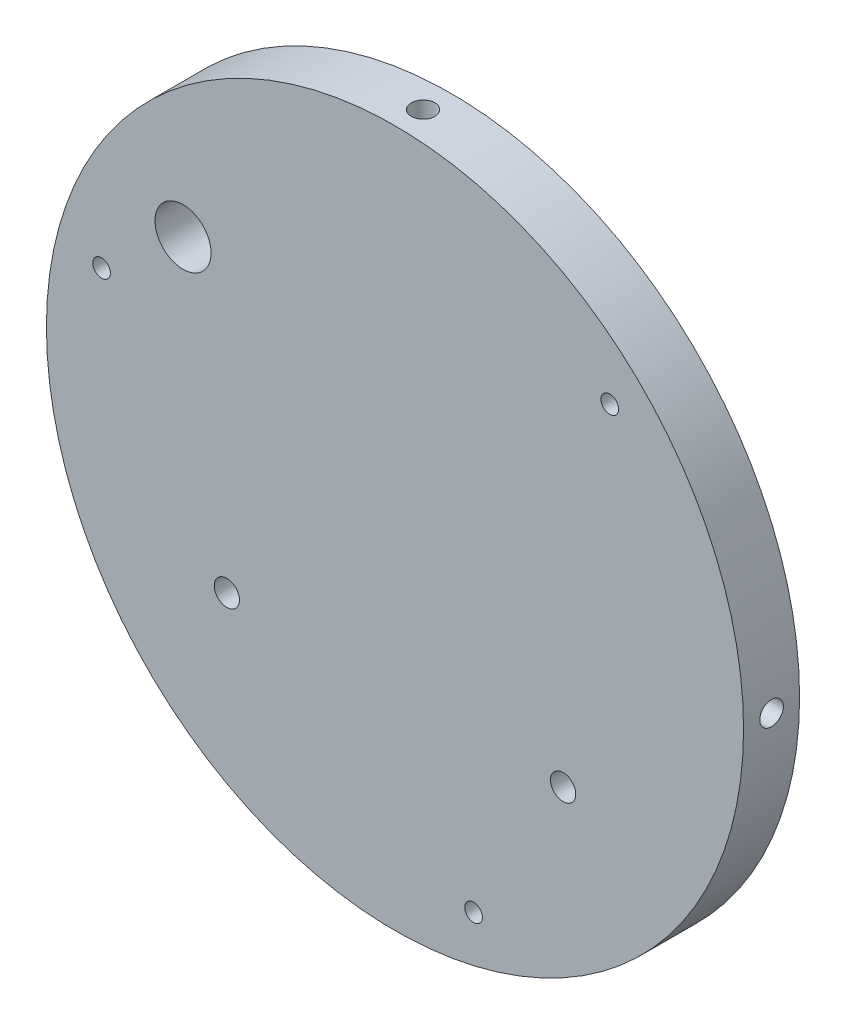
ISO-10303-21;
HEADER;
FILE_DESCRIPTION(('STEP AP214'),'2;1');
FILE_NAME('part.step','',(''),(''),'','','');
FILE_SCHEMA(('AUTOMOTIVE_DESIGN { 1 0 10303 214 1 1 1 1 }'));
ENDSEC;
DATA;
#1=APPLICATION_CONTEXT('core data for automotive mechanical design processes');
#2=APPLICATION_PROTOCOL_DEFINITION('international standard','automotive_design',2000,#1);
#3=PRODUCT_CONTEXT('',#1,'mechanical');
#4=PRODUCT('Part','Part','',(#3));
#5=PRODUCT_RELATED_PRODUCT_CATEGORY('part','',(#4));
#6=PRODUCT_DEFINITION_FORMATION('','',#4);
#7=PRODUCT_DEFINITION_CONTEXT('part definition',#1,'design');
#8=PRODUCT_DEFINITION('design','',#6,#7);
#9=PRODUCT_DEFINITION_SHAPE('','',#8);
#10=(LENGTH_UNIT() NAMED_UNIT(*) SI_UNIT(.MILLI.,.METRE.));
#11=(NAMED_UNIT(*) PLANE_ANGLE_UNIT() SI_UNIT($,.RADIAN.));
#12=(NAMED_UNIT(*) SI_UNIT($,.STERADIAN.) SOLID_ANGLE_UNIT());
#13=UNCERTAINTY_MEASURE_WITH_UNIT(LENGTH_MEASURE(1.E-05),#10,'distance_accuracy_value','');
#14=(GEOMETRIC_REPRESENTATION_CONTEXT(3) GLOBAL_UNCERTAINTY_ASSIGNED_CONTEXT((#13)) GLOBAL_UNIT_ASSIGNED_CONTEXT((#10,
#11,#12)) REPRESENTATION_CONTEXT('',''));
#15=CARTESIAN_POINT('',(0.,0.,0.));
#16=DIRECTION('',(0.,0.,1.));
#17=DIRECTION('',(1.,0.,0.));
#18=AXIS2_PLACEMENT_3D('',#15,#16,#17);
#19=CARTESIAN_POINT('',(0.,0.,10.));
#20=DIRECTION('',(0.,0.,-1.));
#21=DIRECTION('',(-1.,0.,0.));
#22=AXIS2_PLACEMENT_3D('',#19,#20,#21);
#23=CYLINDRICAL_SURFACE('',#22,62.2);
#24=CARTESIAN_POINT('',(62.2,0.,2.90000000000002));
#25=CARTESIAN_POINT('',(62.1999995228843,-0.117921871696008,2.90000521827124));
#26=CARTESIAN_POINT('',(62.1996610601632,-0.235928392208458,2.90996589112799));
#27=CARTESIAN_POINT('',(62.1983434030375,-0.468688999891374,2.94956138390672));
#28=CARTESIAN_POINT('',(62.1973634448577,-0.58343903970644,2.97921965673798));
#29=CARTESIAN_POINT('',(62.1948737650479,-0.806281045750301,3.05736286669379));
#30=CARTESIAN_POINT('',(62.1933643042355,-0.914376259193065,3.10583853617137));
#31=CARTESIAN_POINT('',(62.1899858437334,-1.12086474878596,3.22022705517114));
#32=CARTESIAN_POINT('',(62.188116931407,-1.21926037361513,3.28613566913584));
#33=CARTESIAN_POINT('',(62.1842288487434,-1.40363976912057,3.43356025296681));
#34=CARTESIAN_POINT('',(62.1822096096363,-1.48961780560701,3.51508339314055));
#35=CARTESIAN_POINT('',(62.1782490575684,-1.64667301334969,3.69140986819537));
#36=CARTESIAN_POINT('',(62.1763077477253,-1.71774958890871,3.7862137337309));
#37=CARTESIAN_POINT('',(62.1727215881386,-1.84299516961154,3.98643430367394));
#38=CARTESIAN_POINT('',(62.1710768038846,-1.89716044170982,4.09185334452071));
#39=CARTESIAN_POINT('',(62.1682698617957,-1.98702168169521,4.31029521300685));
#40=CARTESIAN_POINT('',(62.1671077017667,-2.02271773354497,4.42331800607628));
#41=CARTESIAN_POINT('',(62.1653975878178,-2.07461413121286,4.65371309298723));
#42=CARTESIAN_POINT('',(62.1648493980155,-2.09082196442175,4.77108369851822));
#43=CARTESIAN_POINT('',(62.1644283273597,-2.10330491836921,5.00688096411423));
#44=CARTESIAN_POINT('',(62.1645554434159,-2.09958013032172,5.12530761934417));
#45=CARTESIAN_POINT('',(62.1654704302788,-2.07230987897916,5.35980448372455));
#46=CARTESIAN_POINT('',(62.1662580313722,-2.04877250626408,5.4758756349474));
#47=CARTESIAN_POINT('',(62.1684047800248,-1.98255774512299,5.70241821814752));
#48=CARTESIAN_POINT('',(62.1697639290162,-1.93988030873506,5.812889636092));
#49=CARTESIAN_POINT('',(62.1729008733443,-1.83658759691613,6.02512292049916));
#50=CARTESIAN_POINT('',(62.1746787551475,-1.77596861596383,6.12688298217634));
#51=CARTESIAN_POINT('',(62.1784526598875,-1.63851630694105,6.31878517013847));
#52=CARTESIAN_POINT('',(62.1804486834788,-1.56168293021168,6.40892726155696));
#53=CARTESIAN_POINT('',(62.18443506682,-1.39393709941437,6.57508182755125));
#54=CARTESIAN_POINT('',(62.1864254232426,-1.30301763180228,6.65108722167467));
#55=CARTESIAN_POINT('',(62.1901751431556,-1.10970521874218,6.78675635336687));
#56=CARTESIAN_POINT('',(62.1919345066061,-1.00731227131613,6.84642008811833));
#57=CARTESIAN_POINT('',(62.1950239513339,-0.793955499551281,6.94771148809649));
#58=CARTESIAN_POINT('',(62.1963540272239,-0.682991567674012,6.98933892698199));
#59=CARTESIAN_POINT('',(62.1984348827603,-0.455644476948873,7.05337154470448));
#60=CARTESIAN_POINT('',(62.1991856643971,-0.339261336722626,7.07577678958812));
#61=CARTESIAN_POINT('',(62.2000230477247,-0.104441046328394,7.10072033104255));
#62=CARTESIAN_POINT('',(62.2001099769282,0.0139950620941909,7.10326842418337));
#63=CARTESIAN_POINT('',(62.1996107245575,0.249613345264264,7.08845086598514));
#64=CARTESIAN_POINT('',(62.1990245439798,0.366795521867723,7.07108524412494));
#65=CARTESIAN_POINT('',(62.1972453402662,0.596552225833195,7.01694131128034));
#66=CARTESIAN_POINT('',(62.1960524562983,0.709127803478851,6.9801674521588));
#67=CARTESIAN_POINT('',(62.1931942480038,0.926507956559247,6.8882554384375));
#68=CARTESIAN_POINT('',(62.1915289224611,1.03131251198822,6.83311723656247));
#69=CARTESIAN_POINT('',(62.1879125767883,1.23022067333691,6.70601650685862));
#70=CARTESIAN_POINT('',(62.1859614448766,1.32432006666112,6.63404738969222));
#71=CARTESIAN_POINT('',(62.1819937285435,1.49910444829908,6.47533743826484));
#72=CARTESIAN_POINT('',(62.1799771439172,1.5797893946083,6.3885965577509));
#73=CARTESIAN_POINT('',(62.1761049192071,1.72548728421683,6.20276333207921));
#74=CARTESIAN_POINT('',(62.1742493442571,1.7904939038775,6.10366602749134));
#75=CARTESIAN_POINT('',(62.1709093759946,1.90294661298926,5.89595822430624));
#76=CARTESIAN_POINT('',(62.1694249817285,1.95039274756439,5.78734775015527));
#77=CARTESIAN_POINT('',(62.1669952063006,2.02636658906397,5.56372041215742));
#78=CARTESIAN_POINT('',(62.1660497088282,2.05489837850727,5.44870493659531));
#79=CARTESIAN_POINT('',(62.1648040052865,2.09224699407263,5.21551284297712));
#80=CARTESIAN_POINT('',(62.1645037981866,2.10106385167895,5.0973362299696));
#81=CARTESIAN_POINT('',(62.1645825651981,2.09873186316981,4.86123965921102));
#82=CARTESIAN_POINT('',(62.1649612002816,2.08759298336582,4.74331960277602));
#83=CARTESIAN_POINT('',(62.1663542554566,2.04568623102319,4.51102435325299));
#84=CARTESIAN_POINT('',(62.1673686768023,2.0149183197576,4.39664916715926));
#85=CARTESIAN_POINT('',(62.1699188931094,1.93462845889203,4.17468703639456));
#86=CARTESIAN_POINT('',(62.1714546962994,1.88510621330314,4.06710019889146));
#87=CARTESIAN_POINT('',(62.1748744853429,1.7687163159461,3.86176945156795));
#88=CARTESIAN_POINT('',(62.1767584588914,1.70184927714044,3.7640251940816));
#89=CARTESIAN_POINT('',(62.1806632033705,1.55263647377829,3.58110710680647));
#90=CARTESIAN_POINT('',(62.1826840277186,1.47028464242489,3.49593822736106));
#91=CARTESIAN_POINT('',(62.1866346234766,1.29242747239362,3.34061084518944));
#92=CARTESIAN_POINT('',(62.1885643722393,1.19691888499251,3.27045606076811));
#93=CARTESIAN_POINT('',(62.1921160649642,0.995416393662266,3.14713329257175));
#94=CARTESIAN_POINT('',(62.1937377943162,0.889415256783865,3.09397713495684));
#95=CARTESIAN_POINT('',(62.1964869374725,0.670069047954388,3.00627816069541));
#96=CARTESIAN_POINT('',(62.1976149395966,0.556732902273013,2.9717131797035));
#97=CARTESIAN_POINT('',(62.1989485178722,0.368902138957697,2.93132376969888));
#98=CARTESIAN_POINT('',(62.1993411095044,0.295626326564162,2.91959216853817));
#99=CARTESIAN_POINT('',(62.1998670005043,0.148244829274505,2.90392864475261));
#100=CARTESIAN_POINT('',(62.2000002999694,0.0741391446899825,2.89999671919927));
#101=CARTESIAN_POINT('',(62.2,0.,2.90000000000002));
#102=B_SPLINE_CURVE_WITH_KNOTS('',3,(#24,#25,#26,#27,#28,#29,#30,#31,#32,#33,#34,#35,#36,#37,
#38,#39,#40,#41,#42,#43,#44,#45,#46,#47,#48,#49,#50,#51,#52,#53,#54,#55,#56,#57,#58,#59,#60,#61,
#62,#63,#64,#65,#66,#67,#68,#69,#70,#71,#72,#73,#74,#75,#76,#77,#78,#79,#80,#81,#82,#83,#84,#85,
#86,#87,#88,#89,#90,#91,#92,#93,#94,#95,#96,#97,#98,#99,#100,#101),.UNSPECIFIED.,.T.,.F.,(4,2,2,
2,2,2,2,2,2,2,2,2,2,2,2,2,2,2,2,2,2,2,2,2,2,2,2,2,2,2,2,2,2,2,2,2,2,2,4),(0.,0.353494994901829,
0.707411634287802,1.06115418893872,1.41481087612032,1.76863035616156,2.12246397770949,
2.47637565028763,2.83028571393899,3.18405976154053,3.53783219023334,3.89146022401641,
4.24508914393936,4.59879115093565,4.95249421939551,5.3063739679683,5.66025377755057,
6.01413802791523,6.36802106234346,6.7217294967289,7.07543740751052,7.42906421998602,
7.78269194280895,8.13645834406021,8.49022585303618,8.84413581156709,9.19804486067212,
9.55187749628292,9.90570956683107,10.2593649755216,10.6130210819563,10.9666827701751,
11.320331961743,11.6741199995532,12.0279955533545,12.3821167699382,12.7358148631733,
12.9580622379598,13.1803095293001),.UNSPECIFIED.);
#103=CARTESIAN_POINT('',(62.2,0.,2.90000000000002));
#104=VERTEX_POINT('',#103);
#105=EDGE_CURVE('E11',#104,#104,#102,.T.);
#106=ORIENTED_EDGE('',*,*,#105,.T.);
#107=EDGE_LOOP('',(#106));
#108=FACE_BOUND('',#107,.T.);
#109=CARTESIAN_POINT('',(0.,-62.2,2.90000000000002));
#110=CARTESIAN_POINT('',(-0.117921871696008,-62.1999995228843,2.9000052182712));
#111=CARTESIAN_POINT('',(-0.235928392208461,-62.1996610601632,2.90996589112792));
#112=CARTESIAN_POINT('',(-0.468688999891389,-62.1983434030375,2.94956138390658));
#113=CARTESIAN_POINT('',(-0.583439039706465,-62.1973634448577,2.9792196567378));
#114=CARTESIAN_POINT('',(-0.80628104575035,-62.1948737650479,3.05736286669354));
#115=CARTESIAN_POINT('',(-0.91437625919313,-62.1933643042355,3.10583853617109));
#116=CARTESIAN_POINT('',(-1.12086474878606,-62.1899858437334,3.22022705517079));
#117=CARTESIAN_POINT('',(-1.21926037361525,-62.188116931407,3.28613566913546));
#118=CARTESIAN_POINT('',(-1.40363976912073,-62.1842288487434,3.43356025296637));
#119=CARTESIAN_POINT('',(-1.4896178056072,-62.1822096096363,3.51508339314009));
#120=CARTESIAN_POINT('',(-1.64667301334994,-62.1782490575684,3.69140986819486));
#121=CARTESIAN_POINT('',(-1.71774958890899,-62.1763077477253,3.78621373373037));
#122=CARTESIAN_POINT('',(-1.84299516961188,-62.1727215881386,3.98643430367337));
#123=CARTESIAN_POINT('',(-1.89716044171019,-62.1710768038846,4.09185334452012));
#124=CARTESIAN_POINT('',(-1.98702168169565,-62.1682698617957,4.31029521300624));
#125=CARTESIAN_POINT('',(-2.02271773354545,-62.1671077017667,4.42331800607565));
#126=CARTESIAN_POINT('',(-2.0746141312134,-62.1653975878178,4.65371309298659));
#127=CARTESIAN_POINT('',(-2.09082196442233,-62.1648493980155,4.77108369851757));
#128=CARTESIAN_POINT('',(-2.10330491836987,-62.1644283273597,5.00688096411357));
#129=CARTESIAN_POINT('',(-2.09958013032241,-62.1645554434159,5.12530761934352));
#130=CARTESIAN_POINT('',(-2.07230987897992,-62.1654704302788,5.35980448372391));
#131=CARTESIAN_POINT('',(-2.04877250626488,-62.1662580313722,5.47587563494676));
#132=CARTESIAN_POINT('',(-1.98255774512386,-62.1684047800248,5.70241821814691));
#133=CARTESIAN_POINT('',(-1.93988030873596,-62.1697639290162,5.8128896360914));
#134=CARTESIAN_POINT('',(-1.8365875969171,-62.1729008733443,6.02512292049859));
#135=CARTESIAN_POINT('',(-1.77596861596483,-62.1746787551475,6.12688298217579));
#136=CARTESIAN_POINT('',(-1.63851630694211,-62.1784526598874,6.31878517013796));
#137=CARTESIAN_POINT('',(-1.56168293021277,-62.1804486834788,6.40892726155647));
#138=CARTESIAN_POINT('',(-1.39393709941551,-62.1844350668199,6.57508182755082));
#139=CARTESIAN_POINT('',(-1.30301763180344,-62.1864254232426,6.65108722167427));
#140=CARTESIAN_POINT('',(-1.10970521874338,-62.1901751431556,6.78675635336653));
#141=CARTESIAN_POINT('',(-1.00731227131735,-62.1919345066061,6.84642008811801));
#142=CARTESIAN_POINT('',(-0.793955499552537,-62.1950239513339,6.94771148809624));
#143=CARTESIAN_POINT('',(-0.68299156767528,-62.1963540272239,6.98933892698178));
#144=CARTESIAN_POINT('',(-0.45564447695016,-62.1984348827603,7.05337154470434));
#145=CARTESIAN_POINT('',(-0.33926133672392,-62.1991856643971,7.07577678958802));
#146=CARTESIAN_POINT('',(-0.104441046329695,-62.2000230477247,7.10072033104252));
#147=CARTESIAN_POINT('',(0.0139950620928887,-62.2001099769282,7.10326842418337));
#148=CARTESIAN_POINT('',(0.249613345262966,-62.1996107245575,7.08845086598522));
#149=CARTESIAN_POINT('',(0.366795521866431,-62.1990245439798,7.07108524412505));
#150=CARTESIAN_POINT('',(0.59655222583192,-62.1972453402662,7.01694131128053));
#151=CARTESIAN_POINT('',(0.709127803477588,-62.1960524562983,6.98016745215902));
#152=CARTESIAN_POINT('',(0.926507956558012,-62.1931942480039,6.88825543843778));
#153=CARTESIAN_POINT('',(1.031312511987,-62.1915289224611,6.83311723656279));
#154=CARTESIAN_POINT('',(1.23022067333573,-62.1879125767883,6.706016506859));
#155=CARTESIAN_POINT('',(1.32432006665996,-62.1859614448766,6.63404738969263));
#156=CARTESIAN_POINT('',(1.49910444829798,-62.1819937285435,6.47533743826531));
#157=CARTESIAN_POINT('',(1.57978939460722,-62.1799771439172,6.38859655775139));
#158=CARTESIAN_POINT('',(1.72548728421581,-62.1761049192072,6.20276333207975));
#159=CARTESIAN_POINT('',(1.79049390387651,-62.1742493442571,6.10366602749189));
#160=CARTESIAN_POINT('',(1.90294661298833,-62.1709093759947,5.89595822430682));
#161=CARTESIAN_POINT('',(1.95039274756349,-62.1694249817285,5.78734775015588));
#162=CARTESIAN_POINT('',(2.02636658906314,-62.1669952063007,5.56372041215805));
#163=CARTESIAN_POINT('',(2.05489837850648,-62.1660497088283,5.44870493659595));
#164=CARTESIAN_POINT('',(2.09224699407191,-62.1648040052865,5.21551284297777));
#165=CARTESIAN_POINT('',(2.10106385167827,-62.1645037981866,5.09733622997025));
#166=CARTESIAN_POINT('',(2.0987318631692,-62.1645825651981,4.86123965921167));
#167=CARTESIAN_POINT('',(2.08759298336524,-62.1649612002816,4.74331960277667));
#168=CARTESIAN_POINT('',(2.04568623102269,-62.1663542554566,4.51102435325363));
#169=CARTESIAN_POINT('',(2.01491831975714,-62.1673686768023,4.39664916715989));
#170=CARTESIAN_POINT('',(1.93462845889163,-62.1699188931094,4.17468703639515));
#171=CARTESIAN_POINT('',(1.88510621330278,-62.1714546962994,4.06710019889205));
#172=CARTESIAN_POINT('',(1.7687163159458,-62.1748744853429,3.8617694515685));
#173=CARTESIAN_POINT('',(1.70184927714017,-62.1767584588915,3.76402519408212));
#174=CARTESIAN_POINT('',(1.55263647377808,-62.1806632033705,3.58110710680695));
#175=CARTESIAN_POINT('',(1.4702846424247,-62.1826840277186,3.49593822736152));
#176=CARTESIAN_POINT('',(1.29242747239348,-62.1866346234766,3.34061084518984));
#177=CARTESIAN_POINT('',(1.19691888499239,-62.1885643722393,3.27045606076848));
#178=CARTESIAN_POINT('',(0.995416393662187,-62.1921160649642,3.14713329257206));
#179=CARTESIAN_POINT('',(0.889415256783803,-62.1937377943162,3.09397713495711));
#180=CARTESIAN_POINT('',(0.670069047954352,-62.1964869374725,3.00627816069562));
#181=CARTESIAN_POINT('',(0.556732902272989,-62.1976149395966,2.97171317970367));
#182=CARTESIAN_POINT('',(0.368902138957686,-62.1989485178722,2.931323769699));
#183=CARTESIAN_POINT('',(0.295626326564155,-62.1993411095044,2.91959216853826));
#184=CARTESIAN_POINT('',(0.148244829274504,-62.1998670005043,2.90392864475266));
#185=CARTESIAN_POINT('',(0.0741391446899825,-62.2000002999694,2.89999671919929));
#186=CARTESIAN_POINT('',(0.,-62.2,2.90000000000002));
#187=B_SPLINE_CURVE_WITH_KNOTS('',3,(#109,#110,#111,#112,#113,#114,#115,#116,#117,#118,#119,
#120,#121,#122,#123,#124,#125,#126,#127,#128,#129,#130,#131,#132,#133,#134,#135,#136,#137,#138,
#139,#140,#141,#142,#143,#144,#145,#146,#147,#148,#149,#150,#151,#152,#153,#154,#155,#156,#157,
#158,#159,#160,#161,#162,#163,#164,#165,#166,#167,#168,#169,#170,#171,#172,#173,#174,#175,#176,
#177,#178,#179,#180,#181,#182,#183,#184,#185,#186),.UNSPECIFIED.,.T.,.F.,(4,2,2,2,2,2,2,2,2,2,2,
2,2,2,2,2,2,2,2,2,2,2,2,2,2,2,2,2,2,2,2,2,2,2,2,2,2,2,4),(0.,0.35349499490183,0.707411634287803,
1.06115418893873,1.41481087612032,1.76863035616157,2.12246397770949,2.47637565028763,
2.83028571393899,3.18405976154053,3.53783219023334,3.89146022401641,4.24508914393936,
4.59879115093564,4.95249421939551,5.3063739679683,5.66025377755057,6.01413802791524,
6.36802106234346,6.7217294967289,7.07543740751052,7.42906421998602,7.78269194280895,
8.13645834406022,8.49022585303618,8.84413581156709,9.19804486067212,9.55187749628292,
9.90570956683107,10.2593649755216,10.6130210819563,10.9666827701751,11.320331961743,
11.6741199995532,12.0279955533545,12.3821167699383,12.7358148631733,12.9580622379598,
13.1803095293001),.UNSPECIFIED.);
#188=CARTESIAN_POINT('',(0.,-62.2,2.90000000000002));
#189=VERTEX_POINT('',#188);
#190=EDGE_CURVE('E60',#189,#189,#187,.T.);
#191=ORIENTED_EDGE('',*,*,#190,.T.);
#192=EDGE_LOOP('',(#191));
#193=FACE_BOUND('',#192,.T.);
#194=CARTESIAN_POINT('',(-62.2,0.,7.1));
#195=CARTESIAN_POINT('',(-62.1999995228843,-0.117921871696007,7.09999478172884));
#196=CARTESIAN_POINT('',(-62.1996610601632,-0.235928392208462,7.09003410887213));
#197=CARTESIAN_POINT('',(-62.1983434030375,-0.468688999891394,7.05043861609349));
#198=CARTESIAN_POINT('',(-62.1973634448577,-0.583439039706473,7.02078034326228));
#199=CARTESIAN_POINT('',(-62.1948737650479,-0.806281045750366,6.94263713330657));
#200=CARTESIAN_POINT('',(-62.1933643042355,-0.91437625919315,6.89416146382903));
#201=CARTESIAN_POINT('',(-62.1899858437334,-1.12086474878609,6.77977294482935));
#202=CARTESIAN_POINT('',(-62.188116931407,-1.21926037361529,6.71386433086469));
#203=CARTESIAN_POINT('',(-62.1842288487434,-1.40363976912079,6.56643974703379));
#204=CARTESIAN_POINT('',(-62.1822096096363,-1.48961780560726,6.48491660686008));
#205=CARTESIAN_POINT('',(-62.1782490575684,-1.64667301335002,6.30859013180533));
#206=CARTESIAN_POINT('',(-62.1763077477253,-1.71774958890908,6.21378626626983));
#207=CARTESIAN_POINT('',(-62.1727215881386,-1.84299516961199,6.01356569632684));
#208=CARTESIAN_POINT('',(-62.1710768038846,-1.89716044171031,5.9081466554801));
#209=CARTESIAN_POINT('',(-62.1682698617957,-1.9870216816958,5.68970478699399));
#210=CARTESIAN_POINT('',(-62.1671077017667,-2.0227177335456,5.57668199392458));
#211=CARTESIAN_POINT('',(-62.1653975878178,-2.07461413121359,5.34628690701365));
#212=CARTESIAN_POINT('',(-62.1648493980155,-2.09082196442252,5.22891630148267));
#213=CARTESIAN_POINT('',(-62.1644283273597,-2.10330491837008,4.99311903588667));
#214=CARTESIAN_POINT('',(-62.1645554434159,-2.09958013032264,4.87469238065672));
#215=CARTESIAN_POINT('',(-62.1654704302788,-2.07230987898017,4.64019551627632));
#216=CARTESIAN_POINT('',(-62.1662580313722,-2.04877250626514,4.52412436505347));
#217=CARTESIAN_POINT('',(-62.1684047800248,-1.98255774512415,4.29758178185332));
#218=CARTESIAN_POINT('',(-62.1697639290162,-1.93988030873626,4.18711036390882));
#219=CARTESIAN_POINT('',(-62.1729008733442,-1.83658759691742,3.97487707950162));
#220=CARTESIAN_POINT('',(-62.1746787551475,-1.77596861596517,3.87311701782442));
#221=CARTESIAN_POINT('',(-62.1784526598874,-1.63851630694246,3.68121482986223));
#222=CARTESIAN_POINT('',(-62.1804486834788,-1.56168293021313,3.59107273844371));
#223=CARTESIAN_POINT('',(-62.1844350668199,-1.39393709941589,3.42491817244934));
#224=CARTESIAN_POINT('',(-62.1864254232426,-1.30301763180383,3.34891277832589));
#225=CARTESIAN_POINT('',(-62.1901751431556,-1.10970521874378,3.21324364663361));
#226=CARTESIAN_POINT('',(-62.1919345066061,-1.00731227131776,3.15357991188211));
#227=CARTESIAN_POINT('',(-62.1950239513339,-0.793955499552956,3.05228851190386));
#228=CARTESIAN_POINT('',(-62.1963540272239,-0.682991567675703,3.01066107301832));
#229=CARTESIAN_POINT('',(-62.1984348827603,-0.45564447695059,2.94662845529573));
#230=CARTESIAN_POINT('',(-62.1991856643971,-0.339261336724352,2.92422321041204));
#231=CARTESIAN_POINT('',(-62.2000230477247,-0.104441046330129,2.89927966895752));
#232=CARTESIAN_POINT('',(-62.2001099769282,0.0139950620924546,2.89673157581665));
#233=CARTESIAN_POINT('',(-62.1996107245575,0.249613345262534,2.91154913401478));
#234=CARTESIAN_POINT('',(-62.1990245439798,0.366795521866001,2.92891475587493));
#235=CARTESIAN_POINT('',(-62.1972453402662,0.596552225831495,2.98305868871944));
#236=CARTESIAN_POINT('',(-62.1960524562983,0.709127803477167,3.01983254784093));
#237=CARTESIAN_POINT('',(-62.1931942480039,0.926507956557601,3.11174456156214));
#238=CARTESIAN_POINT('',(-62.1915289224611,1.03131251198659,3.16688276343713));
#239=CARTESIAN_POINT('',(-62.1879125767883,1.23022067333534,3.2939834931409));
#240=CARTESIAN_POINT('',(-62.1859614448766,1.32432006665958,3.36595261030726));
#241=CARTESIAN_POINT('',(-62.1819937285436,1.49910444829761,3.52466256173456));
#242=CARTESIAN_POINT('',(-62.1799771439172,1.57978939460686,3.61140344224847));
#243=CARTESIAN_POINT('',(-62.1761049192072,1.72548728421546,3.7972366679201));
#244=CARTESIAN_POINT('',(-62.1742493442571,1.79049390387618,3.89633397250795));
#245=CARTESIAN_POINT('',(-62.1709093759947,1.90294661298802,4.104041775693));
#246=CARTESIAN_POINT('',(-62.1694249817285,1.95039274756319,4.21265224984394));
#247=CARTESIAN_POINT('',(-62.1669952063007,2.02636658906287,4.43627958784177));
#248=CARTESIAN_POINT('',(-62.1660497088283,2.05489837850622,4.55129506340386));
#249=CARTESIAN_POINT('',(-62.1648040052865,2.09224699407167,4.78448715702204));
#250=CARTESIAN_POINT('',(-62.1645037981866,2.10106385167804,4.90266377002955));
#251=CARTESIAN_POINT('',(-62.1645825651981,2.098731863169,5.13876034078814));
#252=CARTESIAN_POINT('',(-62.1649612002816,2.08759298336505,5.25668039722314));
#253=CARTESIAN_POINT('',(-62.1663542554566,2.04568623102253,5.48897564674618));
#254=CARTESIAN_POINT('',(-62.1673686768023,2.01491831975698,5.60335083283993));
#255=CARTESIAN_POINT('',(-62.1699188931094,1.9346284588915,5.82531296360467));
#256=CARTESIAN_POINT('',(-62.1714546962994,1.88510621330266,5.93289980110778));
#257=CARTESIAN_POINT('',(-62.1748744853429,1.7687163159457,6.13823054843134));
#258=CARTESIAN_POINT('',(-62.1767584588915,1.70184927714008,6.23597480591772));
#259=CARTESIAN_POINT('',(-62.1806632033705,1.55263647377801,6.41889289319291));
#260=CARTESIAN_POINT('',(-62.1826840277186,1.47028464242464,6.50406177263835));
#261=CARTESIAN_POINT('',(-62.1866346234766,1.29242747239343,6.65938915481005));
#262=CARTESIAN_POINT('',(-62.1885643722393,1.19691888499235,6.72954393923142));
#263=CARTESIAN_POINT('',(-62.1921160649642,0.995416393662163,6.85286670742786));
#264=CARTESIAN_POINT('',(-62.1937377943162,0.889415256783785,6.90602286504282));
#265=CARTESIAN_POINT('',(-62.1964869374725,0.670069047954343,6.99372183930433));
#266=CARTESIAN_POINT('',(-62.1976149395966,0.556732902272983,7.02828682029629));
#267=CARTESIAN_POINT('',(-62.1989485178722,0.368902138957684,7.06867623030099));
#268=CARTESIAN_POINT('',(-62.1993411095044,0.295626326564155,7.08040783146173));
#269=CARTESIAN_POINT('',(-62.1998670005043,0.148244829274505,7.09607135524735));
#270=CARTESIAN_POINT('',(-62.2000002999694,0.0741391446899831,7.10000328080072));
#271=CARTESIAN_POINT('',(-62.2,0.,7.1));
#272=B_SPLINE_CURVE_WITH_KNOTS('',3,(#194,#195,#196,#197,#198,#199,#200,#201,#202,#203,#204,
#205,#206,#207,#208,#209,#210,#211,#212,#213,#214,#215,#216,#217,#218,#219,#220,#221,#222,#223,
#224,#225,#226,#227,#228,#229,#230,#231,#232,#233,#234,#235,#236,#237,#238,#239,#240,#241,#242,
#243,#244,#245,#246,#247,#248,#249,#250,#251,#252,#253,#254,#255,#256,#257,#258,#259,#260,#261,
#262,#263,#264,#265,#266,#267,#268,#269,#270,#271),.UNSPECIFIED.,.T.,.F.,(4,2,2,2,2,2,2,2,2,2,2,
2,2,2,2,2,2,2,2,2,2,2,2,2,2,2,2,2,2,2,2,2,2,2,2,2,2,2,4),(0.,0.353494994901829,
0.707411634287802,1.06115418893872,1.41481087612032,1.76863035616156,2.12246397770949,
2.47637565028763,2.83028571393899,3.18405976154053,3.53783219023334,3.89146022401641,
4.24508914393936,4.59879115093564,4.9524942193955,5.30637396796829,5.66025377755057,
6.01413802791523,6.36802106234346,6.7217294967289,7.07543740751052,7.42906421998602,
7.78269194280895,8.13645834406021,8.49022585303618,8.84413581156708,9.19804486067212,
9.55187749628292,9.90570956683107,10.2593649755216,10.6130210819563,10.9666827701751,
11.320331961743,11.6741199995532,12.0279955533545,12.3821167699382,12.7358148631733,
12.9580622379598,13.1803095293001),.UNSPECIFIED.);
#273=CARTESIAN_POINT('',(-62.2,0.,7.1));
#274=VERTEX_POINT('',#273);
#275=EDGE_CURVE('E142',#274,#274,#272,.T.);
#276=ORIENTED_EDGE('',*,*,#275,.T.);
#277=EDGE_LOOP('',(#276));
#278=FACE_BOUND('',#277,.T.);
#279=CARTESIAN_POINT('',(0.,62.2,7.1));
#280=CARTESIAN_POINT('',(-0.117921871696008,62.1999995228843,7.09999478172882));
#281=CARTESIAN_POINT('',(-0.235928392208461,62.1996610601632,7.09003410887211));
#282=CARTESIAN_POINT('',(-0.468688999891389,62.1983434030375,7.05043861609345));
#283=CARTESIAN_POINT('',(-0.583439039706465,62.1973634448577,7.02078034326222));
#284=CARTESIAN_POINT('',(-0.80628104575035,62.1948737650479,6.94263713330648));
#285=CARTESIAN_POINT('',(-0.914376259193129,62.1933643042355,6.89416146382894));
#286=CARTESIAN_POINT('',(-1.12086474878606,62.1899858437334,6.77977294482923));
#287=CARTESIAN_POINT('',(-1.21926037361525,62.188116931407,6.71386433086456));
#288=CARTESIAN_POINT('',(-1.40363976912073,62.1842288487434,6.56643974703365));
#289=CARTESIAN_POINT('',(-1.4896178056072,62.1822096096363,6.48491660685993));
#290=CARTESIAN_POINT('',(-1.64667301334994,62.1782490575684,6.30859013180516));
#291=CARTESIAN_POINT('',(-1.71774958890899,62.1763077477253,6.21378626626965));
#292=CARTESIAN_POINT('',(-1.84299516961188,62.1727215881386,6.01356569632665));
#293=CARTESIAN_POINT('',(-1.89716044171019,62.1710768038846,5.9081466554799));
#294=CARTESIAN_POINT('',(-1.98702168169565,62.1682698617957,5.68970478699379));
#295=CARTESIAN_POINT('',(-2.02271773354545,62.1671077017667,5.57668199392437));
#296=CARTESIAN_POINT('',(-2.0746141312134,62.1653975878178,5.34628690701344));
#297=CARTESIAN_POINT('',(-2.09082196442233,62.1648493980155,5.22891630148245));
#298=CARTESIAN_POINT('',(-2.10330491836986,62.1644283273597,4.99311903588645));
#299=CARTESIAN_POINT('',(-2.09958013032241,62.1645554434159,4.8746923806565));
#300=CARTESIAN_POINT('',(-2.07230987897992,62.1654704302788,4.64019551627611));
#301=CARTESIAN_POINT('',(-2.04877250626488,62.1662580313722,4.52412436505326));
#302=CARTESIAN_POINT('',(-1.98255774512386,62.1684047800248,4.29758178185311));
#303=CARTESIAN_POINT('',(-1.93988030873596,62.1697639290162,4.18711036390862));
#304=CARTESIAN_POINT('',(-1.8365875969171,62.1729008733443,3.97487707950143));
#305=CARTESIAN_POINT('',(-1.77596861596483,62.1746787551475,3.87311701782423));
#306=CARTESIAN_POINT('',(-1.63851630694211,62.1784526598874,3.68121482986206));
#307=CARTESIAN_POINT('',(-1.56168293021277,62.1804486834788,3.59107273844355));
#308=CARTESIAN_POINT('',(-1.39393709941551,62.1844350668199,3.4249181724492));
#309=CARTESIAN_POINT('',(-1.30301763180344,62.1864254232426,3.34891277832575));
#310=CARTESIAN_POINT('',(-1.10970521874338,62.1901751431556,3.21324364663349));
#311=CARTESIAN_POINT('',(-1.00731227131735,62.1919345066061,3.15357991188201));
#312=CARTESIAN_POINT('',(-0.793955499552535,62.1950239513339,3.05228851190378));
#313=CARTESIAN_POINT('',(-0.682991567675278,62.1963540272239,3.01066107301824));
#314=CARTESIAN_POINT('',(-0.455644476950158,62.1984348827603,2.94662845529569));
#315=CARTESIAN_POINT('',(-0.339261336723917,62.1991856643971,2.924223210412));
#316=CARTESIAN_POINT('',(-0.104441046329693,62.2000230477247,2.8992796689575));
#317=CARTESIAN_POINT('',(0.0139950620928911,62.2001099769282,2.89673157581665));
#318=CARTESIAN_POINT('',(0.249613345262969,62.1996107245575,2.9115491340148));
#319=CARTESIAN_POINT('',(0.366795521866434,62.1990245439798,2.92891475587497));
#320=CARTESIAN_POINT('',(0.596552225831923,62.1972453402662,2.9830586887195));
#321=CARTESIAN_POINT('',(0.709127803477591,62.1960524562983,3.01983254784101));
#322=CARTESIAN_POINT('',(0.926507956558014,62.1931942480039,3.11174456156224));
#323=CARTESIAN_POINT('',(1.031312511987,62.1915289224611,3.16688276343723));
#324=CARTESIAN_POINT('',(1.23022067333573,62.1879125767883,3.29398349314102));
#325=CARTESIAN_POINT('',(1.32432006665997,62.1859614448766,3.3659526103074));
#326=CARTESIAN_POINT('',(1.49910444829798,62.1819937285435,3.52466256173472));
#327=CARTESIAN_POINT('',(1.57978939460722,62.1799771439172,3.61140344224863));
#328=CARTESIAN_POINT('',(1.72548728421581,62.1761049192072,3.79723666792028));
#329=CARTESIAN_POINT('',(1.79049390387651,62.1742493442571,3.89633397250813));
#330=CARTESIAN_POINT('',(1.90294661298833,62.1709093759947,4.1040417756932));
#331=CARTESIAN_POINT('',(1.95039274756349,62.1694249817285,4.21265224984415));
#332=CARTESIAN_POINT('',(2.02636658906314,62.1669952063007,4.43627958784198));
#333=CARTESIAN_POINT('',(2.05489837850648,62.1660497088283,4.55129506340408));
#334=CARTESIAN_POINT('',(2.09224699407191,62.1648040052865,4.78448715702226));
#335=CARTESIAN_POINT('',(2.10106385167827,62.1645037981866,4.90266377002977));
#336=CARTESIAN_POINT('',(2.0987318631692,62.1645825651981,5.13876034078836));
#337=CARTESIAN_POINT('',(2.08759298336524,62.1649612002816,5.25668039722336));
#338=CARTESIAN_POINT('',(2.04568623102269,62.1663542554566,5.4889756467464));
#339=CARTESIAN_POINT('',(2.01491831975714,62.1673686768023,5.60335083284014));
#340=CARTESIAN_POINT('',(1.93462845889163,62.1699188931094,5.82531296360487));
#341=CARTESIAN_POINT('',(1.88510621330278,62.1714546962994,5.93289980110798));
#342=CARTESIAN_POINT('',(1.7687163159458,62.1748744853429,6.13823054843152));
#343=CARTESIAN_POINT('',(1.70184927714017,62.1767584588915,6.2359748059179));
#344=CARTESIAN_POINT('',(1.55263647377808,62.1806632033705,6.41889289319307));
#345=CARTESIAN_POINT('',(1.4702846424247,62.1826840277186,6.5040617726385));
#346=CARTESIAN_POINT('',(1.29242747239348,62.1866346234766,6.65938915481018));
#347=CARTESIAN_POINT('',(1.19691888499239,62.1885643722393,6.72954393923154));
#348=CARTESIAN_POINT('',(0.995416393662186,62.1921160649642,6.85286670742797));
#349=CARTESIAN_POINT('',(0.889415256783801,62.1937377943162,6.90602286504291));
#350=CARTESIAN_POINT('',(0.670069047954351,62.1964869374725,6.9937218393044));
#351=CARTESIAN_POINT('',(0.556732902272988,62.1976149395966,7.02828682029635));
#352=CARTESIAN_POINT('',(0.368902138957685,62.1989485178722,7.06867623030102));
#353=CARTESIAN_POINT('',(0.295626326564154,62.1993411095044,7.08040783146177));
#354=CARTESIAN_POINT('',(0.148244829274503,62.1998670005043,7.09607135524736));
#355=CARTESIAN_POINT('',(0.0741391446899821,62.2000002999694,7.10000328080073));
#356=CARTESIAN_POINT('',(0.,62.2,7.1));
#357=B_SPLINE_CURVE_WITH_KNOTS('',3,(#279,#280,#281,#282,#283,#284,#285,#286,#287,#288,#289,
#290,#291,#292,#293,#294,#295,#296,#297,#298,#299,#300,#301,#302,#303,#304,#305,#306,#307,#308,
#309,#310,#311,#312,#313,#314,#315,#316,#317,#318,#319,#320,#321,#322,#323,#324,#325,#326,#327,
#328,#329,#330,#331,#332,#333,#334,#335,#336,#337,#338,#339,#340,#341,#342,#343,#344,#345,#346,
#347,#348,#349,#350,#351,#352,#353,#354,#355,#356),.UNSPECIFIED.,.T.,.F.,(4,2,2,2,2,2,2,2,2,2,2,
2,2,2,2,2,2,2,2,2,2,2,2,2,2,2,2,2,2,2,2,2,2,2,2,2,2,2,4),(0.,0.353494994901829,
0.707411634287802,1.06115418893872,1.41481087612032,1.76863035616156,2.12246397770949,
2.47637565028763,2.83028571393899,3.18405976154053,3.53783219023334,3.89146022401641,
4.24508914393937,4.59879115093565,4.95249421939551,5.3063739679683,5.66025377755058,
6.01413802791524,6.36802106234347,6.7217294967289,7.07543740751052,7.42906421998602,
7.78269194280895,8.13645834406022,8.49022585303618,8.84413581156709,9.19804486067213,
9.55187749628292,9.90570956683107,10.2593649755216,10.6130210819563,10.9666827701751,
11.3203319617431,11.6741199995532,12.0279955533545,12.3821167699383,12.7358148631733,
12.9580622379598,13.1803095293001),.UNSPECIFIED.);
#358=CARTESIAN_POINT('',(0.,62.2,7.1));
#359=VERTEX_POINT('',#358);
#360=EDGE_CURVE('E133',#359,#359,#357,.T.);
#361=ORIENTED_EDGE('',*,*,#360,.T.);
#362=EDGE_LOOP('',(#361));
#363=FACE_BOUND('',#362,.T.);
#364=CARTESIAN_POINT('',(0.,0.,10.));
#365=DIRECTION('',(0.,0.,1.));
#366=DIRECTION('',(1.,0.,0.));
#367=AXIS2_PLACEMENT_3D('',#364,#365,#366);
#368=CIRCLE('',#367,62.2);
#369=CARTESIAN_POINT('',(62.2,0.,10.));
#370=VERTEX_POINT('',#369);
#371=EDGE_CURVE('E130',#370,#370,#368,.T.);
#372=ORIENTED_EDGE('',*,*,#371,.F.);
#373=EDGE_LOOP('',(#372));
#374=FACE_BOUND('',#373,.T.);
#375=CARTESIAN_POINT('',(0.,0.,0.));
#376=DIRECTION('',(0.,0.,1.));
#377=DIRECTION('',(1.,0.,0.));
#378=AXIS2_PLACEMENT_3D('',#375,#376,#377);
#379=CIRCLE('',#378,62.2);
#380=CARTESIAN_POINT('',(62.2,0.,0.));
#381=VERTEX_POINT('',#380);
#382=EDGE_CURVE('E129',#381,#381,#379,.T.);
#383=ORIENTED_EDGE('',*,*,#382,.T.);
#384=EDGE_LOOP('',(#383));
#385=FACE_BOUND('',#384,.T.);
#386=ADVANCED_FACE('F48',(#108,#193,#278,#363,#374,#385),#23,.T.);
#387=CARTESIAN_POINT('',(0.,0.,10.));
#388=DIRECTION('',(0.,0.,1.));
#389=DIRECTION('',(1.,0.,0.));
#390=AXIS2_PLACEMENT_3D('',#387,#388,#389);
#391=PLANE('',#390);
#392=CARTESIAN_POINT('',(30.,-25.,10.));
#393=DIRECTION('',(0.,0.,1.));
#394=DIRECTION('',(1.,0.,0.));
#395=AXIS2_PLACEMENT_3D('',#392,#393,#394);
#396=CIRCLE('',#395,2.25);
#397=CARTESIAN_POINT('',(32.25,-25.,10.));
#398=VERTEX_POINT('',#397);
#399=EDGE_CURVE('E98',#398,#398,#396,.T.);
#400=ORIENTED_EDGE('',*,*,#399,.F.);
#401=EDGE_LOOP('',(#400));
#402=FACE_BOUND('',#401,.T.);
#403=CARTESIAN_POINT('',(-30.,-25.,10.));
#404=DIRECTION('',(0.,0.,1.));
#405=DIRECTION('',(1.,0.,0.));
#406=AXIS2_PLACEMENT_3D('',#403,#404,#405);
#407=CIRCLE('',#406,2.25);
#408=CARTESIAN_POINT('',(-27.75,-25.,10.));
#409=VERTEX_POINT('',#408);
#410=EDGE_CURVE('E101',#409,#409,#407,.T.);
#411=ORIENTED_EDGE('',*,*,#410,.F.);
#412=EDGE_LOOP('',(#411));
#413=FACE_BOUND('',#412,.T.);
#414=CARTESIAN_POINT('',(-37.8185615716988,26.0990210668452,10.));
#415=DIRECTION('',(0.,0.,1.));
#416=DIRECTION('',(1.,0.,0.));
#417=AXIS2_PLACEMENT_3D('',#414,#415,#416);
#418=CIRCLE('',#417,5.);
#419=CARTESIAN_POINT('',(-32.8185615716988,26.0990210668452,10.));
#420=VERTEX_POINT('',#419);
#421=EDGE_CURVE('E97',#420,#420,#418,.T.);
#422=ORIENTED_EDGE('',*,*,#421,.F.);
#423=EDGE_LOOP('',(#422));
#424=FACE_BOUND('',#423,.T.);
#425=CARTESIAN_POINT('',(14.027992244557,-52.3531797848674,10.));
#426=DIRECTION('',(0.,0.,1.));
#427=DIRECTION('',(1.,0.,0.));
#428=AXIS2_PLACEMENT_3D('',#425,#426,#427);
#429=CIRCLE('',#428,1.57499999999999);
#430=CARTESIAN_POINT('',(15.602992244557,-52.3531797848674,10.));
#431=VERTEX_POINT('',#430);
#432=EDGE_CURVE('E109',#431,#431,#429,.T.);
#433=ORIENTED_EDGE('',*,*,#432,.F.);
#434=EDGE_LOOP('',(#433));
#435=FACE_BOUND('',#434,.T.);
#436=CARTESIAN_POINT('',(-52.3531797848675,14.0279922445565,10.));
#437=DIRECTION('',(0.,0.,1.));
#438=DIRECTION('',(1.,0.,0.));
#439=AXIS2_PLACEMENT_3D('',#436,#437,#438);
#440=CIRCLE('',#439,1.57499999999999);
#441=CARTESIAN_POINT('',(-50.7781797848676,14.0279922445565,10.));
#442=VERTEX_POINT('',#441);
#443=EDGE_CURVE('E117',#442,#442,#440,.T.);
#444=ORIENTED_EDGE('',*,*,#443,.F.);
#445=EDGE_LOOP('',(#444));
#446=FACE_BOUND('',#445,.T.);
#447=CARTESIAN_POINT('',(38.3251875403109,38.3251875403108,10.));
#448=DIRECTION('',(0.,0.,1.));
#449=DIRECTION('',(1.,0.,0.));
#450=AXIS2_PLACEMENT_3D('',#447,#448,#449);
#451=CIRCLE('',#450,1.57499999999999);
#452=CARTESIAN_POINT('',(39.9001875403109,38.3251875403108,10.));
#453=VERTEX_POINT('',#452);
#454=EDGE_CURVE('E123',#453,#453,#451,.T.);
#455=ORIENTED_EDGE('',*,*,#454,.F.);
#456=EDGE_LOOP('',(#455));
#457=FACE_BOUND('',#456,.T.);
#458=ORIENTED_EDGE('',*,*,#371,.T.);
#459=EDGE_LOOP('',(#458));
#460=FACE_BOUND('',#459,.T.);
#461=ADVANCED_FACE('F183',(#402,#413,#424,#435,#446,#457,#460),#391,.T.);
#462=CARTESIAN_POINT('',(0.,0.,0.));
#463=DIRECTION('',(0.,0.,1.));
#464=DIRECTION('',(1.,0.,0.));
#465=AXIS2_PLACEMENT_3D('',#462,#463,#464);
#466=PLANE('',#465);
#467=CARTESIAN_POINT('',(30.,-25.,0.));
#468=DIRECTION('',(0.,0.,1.));
#469=DIRECTION('',(1.,0.,0.));
#470=AXIS2_PLACEMENT_3D('',#467,#468,#469);
#471=CIRCLE('',#470,2.25);
#472=CARTESIAN_POINT('',(32.25,-25.,0.));
#473=VERTEX_POINT('',#472);
#474=EDGE_CURVE('E94',#473,#473,#471,.T.);
#475=ORIENTED_EDGE('',*,*,#474,.T.);
#476=EDGE_LOOP('',(#475));
#477=FACE_BOUND('',#476,.T.);
#478=CARTESIAN_POINT('',(-30.,-25.,0.));
#479=DIRECTION('',(0.,0.,1.));
#480=DIRECTION('',(1.,0.,0.));
#481=AXIS2_PLACEMENT_3D('',#478,#479,#480);
#482=CIRCLE('',#481,2.25);
#483=CARTESIAN_POINT('',(-27.75,-25.,0.));
#484=VERTEX_POINT('',#483);
#485=EDGE_CURVE('E93',#484,#484,#482,.T.);
#486=ORIENTED_EDGE('',*,*,#485,.T.);
#487=EDGE_LOOP('',(#486));
#488=FACE_BOUND('',#487,.T.);
#489=CARTESIAN_POINT('',(-37.8185615716988,26.0990210668452,0.));
#490=DIRECTION('',(0.,0.,1.));
#491=DIRECTION('',(1.,0.,0.));
#492=AXIS2_PLACEMENT_3D('',#489,#490,#491);
#493=CIRCLE('',#492,5.);
#494=CARTESIAN_POINT('',(-32.8185615716988,26.0990210668452,0.));
#495=VERTEX_POINT('',#494);
#496=EDGE_CURVE('E106',#495,#495,#493,.T.);
#497=ORIENTED_EDGE('',*,*,#496,.T.);
#498=EDGE_LOOP('',(#497));
#499=FACE_BOUND('',#498,.T.);
#500=CARTESIAN_POINT('',(14.027992244557,-52.3531797848674,0.));
#501=DIRECTION('',(0.,0.,1.));
#502=DIRECTION('',(1.,0.,0.));
#503=AXIS2_PLACEMENT_3D('',#500,#501,#502);
#504=CIRCLE('',#503,1.575);
#505=CARTESIAN_POINT('',(15.602992244557,-52.3531797848674,0.));
#506=VERTEX_POINT('',#505);
#507=EDGE_CURVE('E114',#506,#506,#504,.T.);
#508=ORIENTED_EDGE('',*,*,#507,.T.);
#509=EDGE_LOOP('',(#508));
#510=FACE_BOUND('',#509,.T.);
#511=CARTESIAN_POINT('',(-52.3531797848675,14.0279922445565,0.));
#512=DIRECTION('',(0.,0.,1.));
#513=DIRECTION('',(1.,0.,0.));
#514=AXIS2_PLACEMENT_3D('',#511,#512,#513);
#515=CIRCLE('',#514,1.575);
#516=CARTESIAN_POINT('',(-50.7781797848676,14.0279922445565,0.));
#517=VERTEX_POINT('',#516);
#518=EDGE_CURVE('E120',#517,#517,#515,.T.);
#519=ORIENTED_EDGE('',*,*,#518,.T.);
#520=EDGE_LOOP('',(#519));
#521=FACE_BOUND('',#520,.T.);
#522=CARTESIAN_POINT('',(38.3251875403109,38.3251875403108,0.));
#523=DIRECTION('',(0.,0.,1.));
#524=DIRECTION('',(1.,0.,0.));
#525=AXIS2_PLACEMENT_3D('',#522,#523,#524);
#526=CIRCLE('',#525,1.575);
#527=CARTESIAN_POINT('',(39.9001875403109,38.3251875403108,0.));
#528=VERTEX_POINT('',#527);
#529=EDGE_CURVE('E126',#528,#528,#526,.T.);
#530=ORIENTED_EDGE('',*,*,#529,.T.);
#531=EDGE_LOOP('',(#530));
#532=FACE_BOUND('',#531,.T.);
#533=ORIENTED_EDGE('',*,*,#382,.F.);
#534=EDGE_LOOP('',(#533));
#535=FACE_BOUND('',#534,.T.);
#536=ADVANCED_FACE('F181',(#477,#488,#499,#510,#521,#532,#535),#466,.F.);
#537=CARTESIAN_POINT('',(38.3251875403109,38.3251875403108,10.));
#538=DIRECTION('',(0.,0.,1.));
#539=DIRECTION('',(1.,0.,0.));
#540=AXIS2_PLACEMENT_3D('',#537,#538,#539);
#541=CYLINDRICAL_SURFACE('',#540,1.57499999999999);
#542=ORIENTED_EDGE('',*,*,#529,.F.);
#543=EDGE_LOOP('',(#542));
#544=FACE_BOUND('',#543,.T.);
#545=ORIENTED_EDGE('',*,*,#454,.T.);
#546=EDGE_LOOP('',(#545));
#547=FACE_BOUND('',#546,.T.);
#548=ADVANCED_FACE('F177',(#544,#547),#541,.F.);
#549=CARTESIAN_POINT('',(-52.3531797848675,14.0279922445565,10.));
#550=DIRECTION('',(0.,0.,1.));
#551=DIRECTION('',(1.,0.,0.));
#552=AXIS2_PLACEMENT_3D('',#549,#550,#551);
#553=CYLINDRICAL_SURFACE('',#552,1.57499999999999);
#554=ORIENTED_EDGE('',*,*,#518,.F.);
#555=EDGE_LOOP('',(#554));
#556=FACE_BOUND('',#555,.T.);
#557=ORIENTED_EDGE('',*,*,#443,.T.);
#558=EDGE_LOOP('',(#557));
#559=FACE_BOUND('',#558,.T.);
#560=ADVANCED_FACE('F173',(#556,#559),#553,.F.);
#561=CARTESIAN_POINT('',(14.027992244557,-52.3531797848674,10.));
#562=DIRECTION('',(0.,0.,1.));
#563=DIRECTION('',(1.,0.,0.));
#564=AXIS2_PLACEMENT_3D('',#561,#562,#563);
#565=CYLINDRICAL_SURFACE('',#564,1.57499999999999);
#566=ORIENTED_EDGE('',*,*,#507,.F.);
#567=EDGE_LOOP('',(#566));
#568=FACE_BOUND('',#567,.T.);
#569=ORIENTED_EDGE('',*,*,#432,.T.);
#570=EDGE_LOOP('',(#569));
#571=FACE_BOUND('',#570,.T.);
#572=ADVANCED_FACE('F169',(#568,#571),#565,.F.);
#573=CARTESIAN_POINT('',(-37.8185615716988,26.0990210668452,0.));
#574=DIRECTION('',(0.,0.,1.));
#575=DIRECTION('',(1.,0.,0.));
#576=AXIS2_PLACEMENT_3D('',#573,#574,#575);
#577=CYLINDRICAL_SURFACE('',#576,5.);
#578=ORIENTED_EDGE('',*,*,#496,.F.);
#579=EDGE_LOOP('',(#578));
#580=FACE_BOUND('',#579,.T.);
#581=ORIENTED_EDGE('',*,*,#421,.T.);
#582=EDGE_LOOP('',(#581));
#583=FACE_BOUND('',#582,.T.);
#584=ADVANCED_FACE('F165',(#580,#583),#577,.F.);
#585=CARTESIAN_POINT('',(-30.,-25.,0.));
#586=DIRECTION('',(0.,0.,1.));
#587=DIRECTION('',(1.,0.,0.));
#588=AXIS2_PLACEMENT_3D('',#585,#586,#587);
#589=CYLINDRICAL_SURFACE('',#588,2.25);
#590=ORIENTED_EDGE('',*,*,#485,.F.);
#591=EDGE_LOOP('',(#590));
#592=FACE_BOUND('',#591,.T.);
#593=ORIENTED_EDGE('',*,*,#410,.T.);
#594=EDGE_LOOP('',(#593));
#595=FACE_BOUND('',#594,.T.);
#596=ADVANCED_FACE('F161',(#592,#595),#589,.F.);
#597=CARTESIAN_POINT('',(30.,-25.,0.));
#598=DIRECTION('',(0.,0.,1.));
#599=DIRECTION('',(1.,0.,0.));
#600=AXIS2_PLACEMENT_3D('',#597,#598,#599);
#601=CYLINDRICAL_SURFACE('',#600,2.25);
#602=ORIENTED_EDGE('',*,*,#474,.F.);
#603=EDGE_LOOP('',(#602));
#604=FACE_BOUND('',#603,.T.);
#605=ORIENTED_EDGE('',*,*,#399,.T.);
#606=EDGE_LOOP('',(#605));
#607=FACE_BOUND('',#606,.T.);
#608=ADVANCED_FACE('F153',(#604,#607),#601,.F.);
#609=CARTESIAN_POINT('',(0.,62.2,5.00000000000001));
#610=DIRECTION('',(0.,1.,0.));
#611=DIRECTION('',(0.,0.,1.));
#612=AXIS2_PLACEMENT_3D('',#609,#610,#611);
#613=CYLINDRICAL_SURFACE('',#612,2.09999999999999);
#614=CARTESIAN_POINT('',(0.,49.9,5.00000000000001));
#615=DIRECTION('',(0.,1.,0.));
#616=DIRECTION('',(0.,0.,1.));
#617=AXIS2_PLACEMENT_3D('',#614,#615,#616);
#618=CIRCLE('',#617,2.1);
#619=CARTESIAN_POINT('',(0.,49.9,7.10000000000001));
#620=VERTEX_POINT('',#619);
#621=EDGE_CURVE('E90',#620,#620,#618,.T.);
#622=ORIENTED_EDGE('',*,*,#621,.F.);
#623=EDGE_LOOP('',(#622));
#624=FACE_BOUND('',#623,.T.);
#625=ORIENTED_EDGE('',*,*,#360,.F.);
#626=EDGE_LOOP('',(#625));
#627=FACE_BOUND('',#626,.T.);
#628=ADVANCED_FACE('F147',(#624,#627),#613,.F.);
#629=CARTESIAN_POINT('',(0.,49.9,5.00000000000001));
#630=DIRECTION('',(0.,1.,0.));
#631=DIRECTION('',(0.,0.,1.));
#632=AXIS2_PLACEMENT_3D('',#629,#630,#631);
#633=CONICAL_SURFACE('',#632,2.1,1.02974425867665);
#634=CARTESIAN_POINT('',(0.,48.6381927000421,5.00000000000001));
#635=VERTEX_POINT('',#634);
#636=VERTEX_LOOP('',#635);
#637=FACE_BOUND('',#636,.T.);
#638=ORIENTED_EDGE('',*,*,#621,.T.);
#639=EDGE_LOOP('',(#638));
#640=FACE_BOUND('',#639,.T.);
#641=ADVANCED_FACE('F152',(#637,#640),#633,.F.);
#642=CARTESIAN_POINT('',(-62.2,-2.16557815876469E-13,5.00000000000001));
#643=DIRECTION('',(-1.,0.,0.));
#644=DIRECTION('',(0.,0.,1.));
#645=AXIS2_PLACEMENT_3D('',#642,#643,#644);
#646=CYLINDRICAL_SURFACE('',#645,2.09999999999999);
#647=CARTESIAN_POINT('',(-49.9,-2.16557815876469E-13,5.00000000000001));
#648=DIRECTION('',(-1.,0.,0.));
#649=DIRECTION('',(0.,0.,1.));
#650=AXIS2_PLACEMENT_3D('',#647,#648,#649);
#651=CIRCLE('',#650,2.1);
#652=CARTESIAN_POINT('',(-49.9,-2.16557815876469E-13,7.10000000000001));
#653=VERTEX_POINT('',#652);
#654=EDGE_CURVE('E85',#653,#653,#651,.T.);
#655=ORIENTED_EDGE('',*,*,#654,.F.);
#656=EDGE_LOOP('',(#655));
#657=FACE_BOUND('',#656,.T.);
#658=ORIENTED_EDGE('',*,*,#275,.F.);
#659=EDGE_LOOP('',(#658));
#660=FACE_BOUND('',#659,.T.);
#661=ADVANCED_FACE('F158',(#657,#660),#646,.F.);
#662=CARTESIAN_POINT('',(-49.9,-2.16557815876469E-13,5.00000000000001));
#663=DIRECTION('',(-1.,0.,0.));
#664=DIRECTION('',(0.,0.,1.));
#665=AXIS2_PLACEMENT_3D('',#662,#663,#664);
#666=CONICAL_SURFACE('',#665,2.1,1.02974425867665);
#667=CARTESIAN_POINT('',(-48.6381927000421,-2.19879500656579E-13,5.00000000000001));
#668=VERTEX_POINT('',#667);
#669=VERTEX_LOOP('',#668);
#670=FACE_BOUND('',#669,.T.);
#671=ORIENTED_EDGE('',*,*,#654,.T.);
#672=EDGE_LOOP('',(#671));
#673=FACE_BOUND('',#672,.T.);
#674=ADVANCED_FACE('F155',(#670,#673),#666,.F.);
#675=CARTESIAN_POINT('',(0.,-62.2,5.00000000000001));
#676=DIRECTION('',(0.,-1.,0.));
#677=DIRECTION('',(0.,0.,-1.));
#678=AXIS2_PLACEMENT_3D('',#675,#676,#677);
#679=CYLINDRICAL_SURFACE('',#678,2.09999999999999);
#680=CARTESIAN_POINT('',(0.,-49.9,5.00000000000001));
#681=DIRECTION('',(0.,-1.,0.));
#682=DIRECTION('',(0.,0.,-1.));
#683=AXIS2_PLACEMENT_3D('',#680,#681,#682);
#684=CIRCLE('',#683,2.1);
#685=CARTESIAN_POINT('',(0.,-49.9,2.90000000000001));
#686=VERTEX_POINT('',#685);
#687=EDGE_CURVE('E82',#686,#686,#684,.T.);
#688=ORIENTED_EDGE('',*,*,#687,.F.);
#689=EDGE_LOOP('',(#688));
#690=FACE_BOUND('',#689,.T.);
#691=ORIENTED_EDGE('',*,*,#190,.F.);
#692=EDGE_LOOP('',(#691));
#693=FACE_BOUND('',#692,.T.);
#694=ADVANCED_FACE('F217',(#690,#693),#679,.F.);
#695=CARTESIAN_POINT('',(0.,-49.9,5.00000000000001));
#696=DIRECTION('',(0.,-1.,0.));
#697=DIRECTION('',(0.,0.,-1.));
#698=AXIS2_PLACEMENT_3D('',#695,#696,#697);
#699=CONICAL_SURFACE('',#698,2.1,1.02974425867665);
#700=CARTESIAN_POINT('',(0.,-48.6381927000421,5.00000000000001));
#701=VERTEX_POINT('',#700);
#702=VERTEX_LOOP('',#701);
#703=FACE_BOUND('',#702,.T.);
#704=ORIENTED_EDGE('',*,*,#687,.T.);
#705=EDGE_LOOP('',(#704));
#706=FACE_BOUND('',#705,.T.);
#707=ADVANCED_FACE('F221',(#703,#706),#699,.F.);
#708=CARTESIAN_POINT('',(62.2,6.50898094428555E-13,5.00000000000001));
#709=DIRECTION('',(1.,0.,0.));
#710=DIRECTION('',(0.,0.,-1.));
#711=AXIS2_PLACEMENT_3D('',#708,#709,#710);
#712=CYLINDRICAL_SURFACE('',#711,2.09999999999999);
#713=CARTESIAN_POINT('',(49.9,6.50898094428555E-13,5.00000000000001));
#714=DIRECTION('',(1.,0.,0.));
#715=DIRECTION('',(0.,0.,-1.));
#716=AXIS2_PLACEMENT_3D('',#713,#714,#715);
#717=CIRCLE('',#716,2.1);
#718=CARTESIAN_POINT('',(49.9,6.50898094428555E-13,2.90000000000001));
#719=VERTEX_POINT('',#718);
#720=EDGE_CURVE('E80',#719,#719,#717,.T.);
#721=ORIENTED_EDGE('',*,*,#720,.F.);
#722=EDGE_LOOP('',(#721));
#723=FACE_BOUND('',#722,.T.);
#724=ORIENTED_EDGE('',*,*,#105,.F.);
#725=EDGE_LOOP('',(#724));
#726=FACE_BOUND('',#725,.T.);
#727=ADVANCED_FACE('F76',(#723,#726),#712,.F.);
#728=CARTESIAN_POINT('',(49.9,6.50898094428555E-13,5.00000000000001));
#729=DIRECTION('',(1.,0.,0.));
#730=DIRECTION('',(0.,0.,-1.));
#731=AXIS2_PLACEMENT_3D('',#728,#729,#730);
#732=CONICAL_SURFACE('',#731,2.1,1.02974425867665);
#733=CARTESIAN_POINT('',(48.6381927000421,6.47576409648446E-13,5.00000000000001));
#734=VERTEX_POINT('',#733);
#735=VERTEX_LOOP('',#734);
#736=FACE_BOUND('',#735,.T.);
#737=ORIENTED_EDGE('',*,*,#720,.T.);
#738=EDGE_LOOP('',(#737));
#739=FACE_BOUND('',#738,.T.);
#740=ADVANCED_FACE('F73',(#736,#739),#732,.F.);
#741=CLOSED_SHELL('',(#386,#461,#536,#548,#560,#572,#584,#596,#608,#628,#641,#661,#674,#694,
#707,#727,#740));
#742=MANIFOLD_SOLID_BREP('B2',#741);
#743=ADVANCED_BREP_SHAPE_REPRESENTATION('',(#18,#742),#14);
#744=SHAPE_DEFINITION_REPRESENTATION(#9,#743);
ENDSEC;
END-ISO-10303-21;
